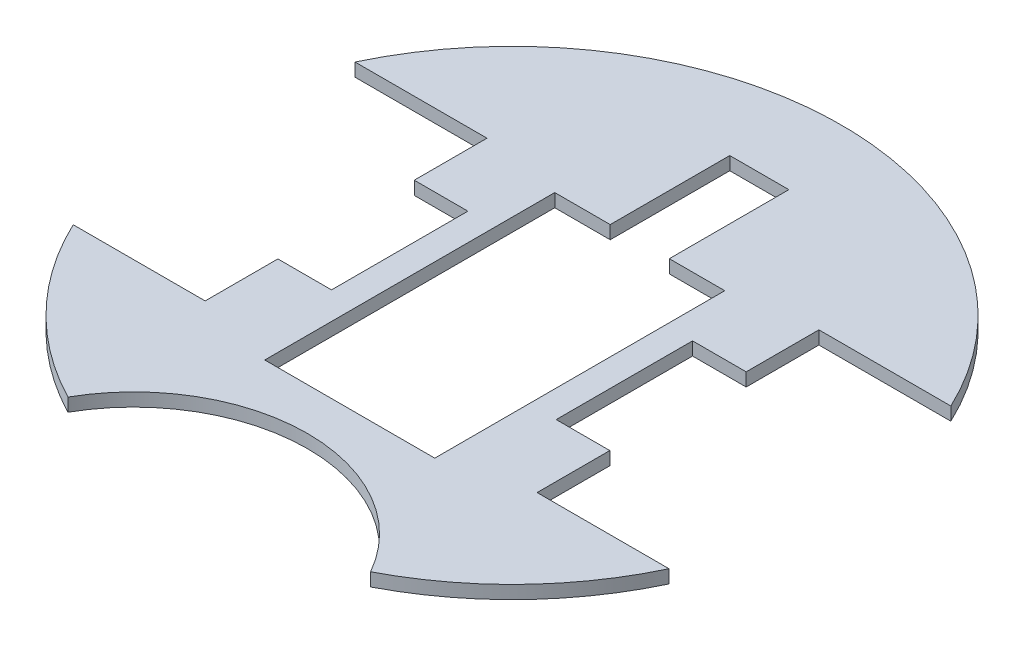
ISO-10303-21;
HEADER;
FILE_DESCRIPTION(('STEP AP214'),'2;1');
FILE_NAME('part.step','',(''),(''),'','','');
FILE_SCHEMA(('AUTOMOTIVE_DESIGN { 1 0 10303 214 1 1 1 1 }'));
ENDSEC;
DATA;
#1=APPLICATION_CONTEXT('core data for automotive mechanical design processes');
#2=APPLICATION_PROTOCOL_DEFINITION('international standard','automotive_design',2000,#1);
#3=PRODUCT_CONTEXT('',#1,'mechanical');
#4=PRODUCT('Part','Part','',(#3));
#5=PRODUCT_RELATED_PRODUCT_CATEGORY('part','',(#4));
#6=PRODUCT_DEFINITION_FORMATION('','',#4);
#7=PRODUCT_DEFINITION_CONTEXT('part definition',#1,'design');
#8=PRODUCT_DEFINITION('design','',#6,#7);
#9=PRODUCT_DEFINITION_SHAPE('','',#8);
#10=(LENGTH_UNIT() NAMED_UNIT(*) SI_UNIT(.MILLI.,.METRE.));
#11=(NAMED_UNIT(*) PLANE_ANGLE_UNIT() SI_UNIT($,.RADIAN.));
#12=(NAMED_UNIT(*) SI_UNIT($,.STERADIAN.) SOLID_ANGLE_UNIT());
#13=UNCERTAINTY_MEASURE_WITH_UNIT(LENGTH_MEASURE(1.E-05),#10,'distance_accuracy_value','');
#14=(GEOMETRIC_REPRESENTATION_CONTEXT(3) GLOBAL_UNCERTAINTY_ASSIGNED_CONTEXT((#13)) GLOBAL_UNIT_ASSIGNED_CONTEXT((#10,
#11,#12)) REPRESENTATION_CONTEXT('',''));
#15=CARTESIAN_POINT('',(0.,0.,0.));
#16=DIRECTION('',(0.,0.,1.));
#17=DIRECTION('',(1.,0.,0.));
#18=AXIS2_PLACEMENT_3D('',#15,#16,#17);
#19=CARTESIAN_POINT('',(18.7,0.,-28.1));
#20=DIRECTION('',(0.,0.,-1.));
#21=DIRECTION('',(-1.,0.,0.));
#22=AXIS2_PLACEMENT_3D('',#19,#20,#21);
#23=PLANE('',#22);
#24=DIRECTION('',(-1.,0.,0.));
#25=VECTOR('',#24,1.);
#26=CARTESIAN_POINT('',(18.7,0.,-28.1));
#27=LINE('',#26,#25);
#28=CARTESIAN_POINT('',(-6.5,0.,-28.1));
#29=VERTEX_POINT('',#28);
#30=CARTESIAN_POINT('',(-18.7,0.,-28.1));
#31=VERTEX_POINT('',#30);
#32=EDGE_CURVE('E221',#29,#31,#27,.T.);
#33=ORIENTED_EDGE('',*,*,#32,.F.);
#34=DIRECTION('',(0.,1.,0.));
#35=VECTOR('',#34,1.);
#36=CARTESIAN_POINT('',(-6.5,0.,-28.1));
#37=LINE('',#36,#35);
#38=CARTESIAN_POINT('',(-6.5,2.9,-28.1));
#39=VERTEX_POINT('',#38);
#40=EDGE_CURVE('E205',#29,#39,#37,.T.);
#41=ORIENTED_EDGE('',*,*,#40,.T.);
#42=DIRECTION('',(-1.,0.,0.));
#43=VECTOR('',#42,1.);
#44=CARTESIAN_POINT('',(18.7,2.9,-28.1));
#45=LINE('',#44,#43);
#46=CARTESIAN_POINT('',(-18.7,2.9,-28.1));
#47=VERTEX_POINT('',#46);
#48=EDGE_CURVE('E248',#39,#47,#45,.T.);
#49=ORIENTED_EDGE('',*,*,#48,.T.);
#50=DIRECTION('',(0.,1.,0.));
#51=VECTOR('',#50,1.);
#52=CARTESIAN_POINT('',(-18.7,0.,-28.1));
#53=LINE('',#52,#51);
#54=EDGE_CURVE('E227',#31,#47,#53,.T.);
#55=ORIENTED_EDGE('',*,*,#54,.F.);
#56=EDGE_LOOP('',(#33,#41,#49,#55));
#57=FACE_BOUND('',#56,.T.);
#58=ADVANCED_FACE('F32',(#57),#23,.F.);
#59=CARTESIAN_POINT('',(0.,2.9,0.));
#60=DIRECTION('',(0.,-1.,0.));
#61=DIRECTION('',(0.,0.,-1.));
#62=AXIS2_PLACEMENT_3D('',#59,#60,#61);
#63=CYLINDRICAL_SURFACE('',#62,72.5);
#64=CARTESIAN_POINT('',(0.,0.,0.));
#65=DIRECTION('',(0.,1.,0.));
#66=DIRECTION('',(0.,0.,1.));
#67=AXIS2_PLACEMENT_3D('',#64,#65,#66);
#68=CIRCLE('',#67,72.5);
#69=CARTESIAN_POINT('',(33.2911053697012,0.,64.4045984636458));
#70=VERTEX_POINT('',#69);
#71=CARTESIAN_POINT('',(65.5381568248605,0.,30.9999999999999));
#72=VERTEX_POINT('',#71);
#73=EDGE_CURVE('E265',#70,#72,#68,.T.);
#74=ORIENTED_EDGE('',*,*,#73,.T.);
#75=DIRECTION('',(0.,1.,0.));
#76=VECTOR('',#75,1.);
#77=CARTESIAN_POINT('',(65.5381568248605,0.,30.9999999999999));
#78=LINE('',#77,#76);
#79=CARTESIAN_POINT('',(65.5381568248605,2.9,30.9999999999999));
#80=VERTEX_POINT('',#79);
#81=EDGE_CURVE('E293',#72,#80,#78,.T.);
#82=ORIENTED_EDGE('',*,*,#81,.T.);
#83=CARTESIAN_POINT('',(0.,2.9,0.));
#84=DIRECTION('',(0.,1.,0.));
#85=DIRECTION('',(0.,0.,1.));
#86=AXIS2_PLACEMENT_3D('',#83,#84,#85);
#87=CIRCLE('',#86,72.5);
#88=CARTESIAN_POINT('',(33.2911053697012,2.9,64.4045984636458));
#89=VERTEX_POINT('',#88);
#90=EDGE_CURVE('E266',#89,#80,#87,.T.);
#91=ORIENTED_EDGE('',*,*,#90,.F.);
#92=DIRECTION('',(0.,-1.,0.));
#93=VECTOR('',#92,1.);
#94=CARTESIAN_POINT('',(33.2911053697012,2.9,64.4045984636458));
#95=LINE('',#94,#93);
#96=EDGE_CURVE('E11',#89,#70,#95,.T.);
#97=ORIENTED_EDGE('',*,*,#96,.T.);
#98=EDGE_LOOP('',(#74,#82,#91,#97));
#99=FACE_BOUND('',#98,.T.);
#100=ADVANCED_FACE('F292',(#99),#63,.T.);
#101=CARTESIAN_POINT('',(-65.5381568248605,2.9,30.9999999999999));
#102=VERTEX_POINT('',#101);
#103=CARTESIAN_POINT('',(-33.2911053697012,2.9,64.4045984636458));
#104=VERTEX_POINT('',#103);
#105=EDGE_CURVE('E264',#102,#104,#87,.T.);
#106=ORIENTED_EDGE('',*,*,#105,.F.);
#107=DIRECTION('',(0.,1.,0.));
#108=VECTOR('',#107,1.);
#109=CARTESIAN_POINT('',(-65.5381568248605,0.,30.9999999999999));
#110=LINE('',#109,#108);
#111=CARTESIAN_POINT('',(-65.5381568248605,0.,30.9999999999999));
#112=VERTEX_POINT('',#111);
#113=EDGE_CURVE('E326',#112,#102,#110,.T.);
#114=ORIENTED_EDGE('',*,*,#113,.F.);
#115=CARTESIAN_POINT('',(-33.2911053697012,0.,64.4045984636458));
#116=VERTEX_POINT('',#115);
#117=EDGE_CURVE('E272',#112,#116,#68,.T.);
#118=ORIENTED_EDGE('',*,*,#117,.T.);
#119=DIRECTION('',(0.,-1.,0.));
#120=VECTOR('',#119,1.);
#121=CARTESIAN_POINT('',(-33.2911053697012,2.9,64.4045984636458));
#122=LINE('',#121,#120);
#123=EDGE_CURVE('E40',#104,#116,#122,.T.);
#124=ORIENTED_EDGE('',*,*,#123,.F.);
#125=EDGE_LOOP('',(#106,#114,#118,#124));
#126=FACE_BOUND('',#125,.T.);
#127=ADVANCED_FACE('F460',(#126),#63,.T.);
#128=CARTESIAN_POINT('',(0.,2.9,83.2397996376034));
#129=DIRECTION('',(0.,-1.,0.));
#130=DIRECTION('',(0.,0.,-1.));
#131=AXIS2_PLACEMENT_3D('',#128,#129,#130);
#132=CYLINDRICAL_SURFACE('',#131,38.25);
#133=CARTESIAN_POINT('',(0.,0.,83.2397996376034));
#134=DIRECTION('',(0.,-1.,0.));
#135=DIRECTION('',(0.,0.,1.));
#136=AXIS2_PLACEMENT_3D('',#133,#134,#135);
#137=CIRCLE('',#136,38.25);
#138=EDGE_CURVE('E254',#116,#70,#137,.T.);
#139=ORIENTED_EDGE('',*,*,#138,.T.);
#140=ORIENTED_EDGE('',*,*,#96,.F.);
#141=CARTESIAN_POINT('',(0.,2.9,83.2397996376034));
#142=DIRECTION('',(0.,-1.,0.));
#143=DIRECTION('',(0.,0.,1.));
#144=AXIS2_PLACEMENT_3D('',#141,#142,#143);
#145=CIRCLE('',#144,38.25);
#146=EDGE_CURVE('E261',#104,#89,#145,.T.);
#147=ORIENTED_EDGE('',*,*,#146,.F.);
#148=ORIENTED_EDGE('',*,*,#123,.T.);
#149=EDGE_LOOP('',(#139,#140,#147,#148));
#150=FACE_BOUND('',#149,.T.);
#151=ADVANCED_FACE('F34',(#150),#132,.F.);
#152=CARTESIAN_POINT('',(65.5381568248604,2.9,-31.0000000000001));
#153=VERTEX_POINT('',#152);
#154=CARTESIAN_POINT('',(-65.5381568248604,2.9,-31.0000000000001));
#155=VERTEX_POINT('',#154);
#156=EDGE_CURVE('E269',#153,#155,#87,.T.);
#157=ORIENTED_EDGE('',*,*,#156,.F.);
#158=DIRECTION('',(0.,1.,0.));
#159=VECTOR('',#158,1.);
#160=CARTESIAN_POINT('',(65.5381568248604,0.,-31.0000000000001));
#161=LINE('',#160,#159);
#162=CARTESIAN_POINT('',(65.5381568248604,0.,-31.0000000000001));
#163=VERTEX_POINT('',#162);
#164=EDGE_CURVE('E382',#163,#153,#161,.T.);
#165=ORIENTED_EDGE('',*,*,#164,.F.);
#166=CARTESIAN_POINT('',(-65.5381568248604,0.,-31.0000000000001));
#167=VERTEX_POINT('',#166);
#168=EDGE_CURVE('E274',#163,#167,#68,.T.);
#169=ORIENTED_EDGE('',*,*,#168,.T.);
#170=DIRECTION('',(0.,1.,0.));
#171=VECTOR('',#170,1.);
#172=CARTESIAN_POINT('',(-65.5381568248604,0.,-31.0000000000001));
#173=LINE('',#172,#171);
#174=EDGE_CURVE('E318',#167,#155,#173,.T.);
#175=ORIENTED_EDGE('',*,*,#174,.T.);
#176=EDGE_LOOP('',(#157,#165,#169,#175));
#177=FACE_BOUND('',#176,.T.);
#178=ADVANCED_FACE('F324',(#177),#63,.T.);
#179=CARTESIAN_POINT('',(0.,2.9,41.6198998188017));
#180=DIRECTION('',(0.,1.,0.));
#181=DIRECTION('',(0.,0.,1.));
#182=AXIS2_PLACEMENT_3D('',#179,#180,#181);
#183=PLANE('',#182);
#184=DIRECTION('',(0.,0.,1.));
#185=VECTOR('',#184,1.);
#186=CARTESIAN_POINT('',(-6.5,2.9,-28.1));
#187=LINE('',#186,#185);
#188=CARTESIAN_POINT('',(-6.5,2.9,-54.4));
#189=VERTEX_POINT('',#188);
#190=EDGE_CURVE('E211',#189,#39,#187,.T.);
#191=ORIENTED_EDGE('',*,*,#190,.F.);
#192=DIRECTION('',(-1.,0.,0.));
#193=VECTOR('',#192,1.);
#194=CARTESIAN_POINT('',(6.5,2.9,-54.4));
#195=LINE('',#194,#193);
#196=CARTESIAN_POINT('',(6.5,2.9,-54.4));
#197=VERTEX_POINT('',#196);
#198=EDGE_CURVE('E224',#197,#189,#195,.T.);
#199=ORIENTED_EDGE('',*,*,#198,.F.);
#200=DIRECTION('',(0.,0.,-1.));
#201=VECTOR('',#200,1.);
#202=CARTESIAN_POINT('',(6.5,2.9,-28.1));
#203=LINE('',#202,#201);
#204=CARTESIAN_POINT('',(6.5,2.9,-28.1));
#205=VERTEX_POINT('',#204);
#206=EDGE_CURVE('E355',#205,#197,#203,.T.);
#207=ORIENTED_EDGE('',*,*,#206,.F.);
#208=CARTESIAN_POINT('',(18.7,2.9,-28.1));
#209=VERTEX_POINT('',#208);
#210=EDGE_CURVE('E249',#209,#205,#45,.T.);
#211=ORIENTED_EDGE('',*,*,#210,.F.);
#212=DIRECTION('',(0.,0.,-1.));
#213=VECTOR('',#212,1.);
#214=CARTESIAN_POINT('',(18.7,2.9,35.7));
#215=LINE('',#214,#213);
#216=CARTESIAN_POINT('',(18.7,2.9,35.7));
#217=VERTEX_POINT('',#216);
#218=EDGE_CURVE('E245',#217,#209,#215,.T.);
#219=ORIENTED_EDGE('',*,*,#218,.F.);
#220=DIRECTION('',(1.,0.,0.));
#221=VECTOR('',#220,1.);
#222=CARTESIAN_POINT('',(-18.7,2.9,35.7));
#223=LINE('',#222,#221);
#224=CARTESIAN_POINT('',(-18.7,2.9,35.7));
#225=VERTEX_POINT('',#224);
#226=EDGE_CURVE('E241',#225,#217,#223,.T.);
#227=ORIENTED_EDGE('',*,*,#226,.F.);
#228=DIRECTION('',(0.,0.,1.));
#229=VECTOR('',#228,1.);
#230=CARTESIAN_POINT('',(-18.7,2.9,-28.1));
#231=LINE('',#230,#229);
#232=EDGE_CURVE('E239',#47,#225,#231,.T.);
#233=ORIENTED_EDGE('',*,*,#232,.F.);
#234=ORIENTED_EDGE('',*,*,#48,.F.);
#235=EDGE_LOOP('',(#191,#199,#207,#211,#219,#227,#233,#234));
#236=FACE_BOUND('',#235,.T.);
#237=DIRECTION('',(1.,0.,0.));
#238=VECTOR('',#237,1.);
#239=CARTESIAN_POINT('',(36.5100000000001,2.9,30.9999999999999));
#240=LINE('',#239,#238);
#241=CARTESIAN_POINT('',(36.5100000000001,2.9,30.9999999999999));
#242=VERTEX_POINT('',#241);
#243=EDGE_CURVE('E368',#242,#80,#240,.T.);
#244=ORIENTED_EDGE('',*,*,#243,.F.);
#245=DIRECTION('',(0.,0.,1.));
#246=VECTOR('',#245,1.);
#247=CARTESIAN_POINT('',(36.5100000000001,2.9,15.));
#248=LINE('',#247,#246);
#249=CARTESIAN_POINT('',(36.5100000000001,2.9,15.));
#250=VERTEX_POINT('',#249);
#251=EDGE_CURVE('E396',#250,#242,#248,.T.);
#252=ORIENTED_EDGE('',*,*,#251,.F.);
#253=DIRECTION('',(1.,0.,0.));
#254=VECTOR('',#253,1.);
#255=CARTESIAN_POINT('',(24.7100000000001,2.9,15.));
#256=LINE('',#255,#254);
#257=CARTESIAN_POINT('',(24.7100000000001,2.9,15.));
#258=VERTEX_POINT('',#257);
#259=EDGE_CURVE('E393',#258,#250,#256,.T.);
#260=ORIENTED_EDGE('',*,*,#259,.F.);
#261=DIRECTION('',(0.,0.,1.));
#262=VECTOR('',#261,1.);
#263=CARTESIAN_POINT('',(24.7100000000001,2.9,-15.0000000000001));
#264=LINE('',#263,#262);
#265=CARTESIAN_POINT('',(24.7100000000001,2.9,-15.0000000000001));
#266=VERTEX_POINT('',#265);
#267=EDGE_CURVE('E390',#266,#258,#264,.T.);
#268=ORIENTED_EDGE('',*,*,#267,.F.);
#269=DIRECTION('',(-1.,0.,0.));
#270=VECTOR('',#269,1.);
#271=CARTESIAN_POINT('',(24.7100000000001,2.9,-15.0000000000001));
#272=LINE('',#271,#270);
#273=CARTESIAN_POINT('',(36.5100000000001,2.9,-15.0000000000001));
#274=VERTEX_POINT('',#273);
#275=EDGE_CURVE('E387',#274,#266,#272,.T.);
#276=ORIENTED_EDGE('',*,*,#275,.F.);
#277=DIRECTION('',(0.,0.,1.));
#278=VECTOR('',#277,1.);
#279=CARTESIAN_POINT('',(36.5100000000001,2.9,-15.0000000000001));
#280=LINE('',#279,#278);
#281=CARTESIAN_POINT('',(36.5100000000001,2.9,-31.0000000000001));
#282=VERTEX_POINT('',#281);
#283=EDGE_CURVE('E384',#282,#274,#280,.T.);
#284=ORIENTED_EDGE('',*,*,#283,.F.);
#285=DIRECTION('',(-1.,0.,0.));
#286=VECTOR('',#285,1.);
#287=CARTESIAN_POINT('',(36.5100000000001,2.9,-31.0000000000001));
#288=LINE('',#287,#286);
#289=EDGE_CURVE('E310',#153,#282,#288,.T.);
#290=ORIENTED_EDGE('',*,*,#289,.F.);
#291=ORIENTED_EDGE('',*,*,#156,.T.);
#292=DIRECTION('',(-1.,0.,0.));
#293=VECTOR('',#292,1.);
#294=CARTESIAN_POINT('',(-36.5100000000001,2.9,-31.0000000000001));
#295=LINE('',#294,#293);
#296=CARTESIAN_POINT('',(-36.5100000000001,2.9,-31.0000000000001));
#297=VERTEX_POINT('',#296);
#298=EDGE_CURVE('E307',#297,#155,#295,.T.);
#299=ORIENTED_EDGE('',*,*,#298,.F.);
#300=DIRECTION('',(0.,0.,-1.));
#301=VECTOR('',#300,1.);
#302=CARTESIAN_POINT('',(-36.5100000000001,2.9,-15.0000000000001));
#303=LINE('',#302,#301);
#304=CARTESIAN_POINT('',(-36.5100000000001,2.9,-15.0000000000001));
#305=VERTEX_POINT('',#304);
#306=EDGE_CURVE('E322',#305,#297,#303,.T.);
#307=ORIENTED_EDGE('',*,*,#306,.F.);
#308=DIRECTION('',(-1.,0.,0.));
#309=VECTOR('',#308,1.);
#310=CARTESIAN_POINT('',(-24.7100000000001,2.9,-15.0000000000001));
#311=LINE('',#310,#309);
#312=CARTESIAN_POINT('',(-24.7100000000001,2.9,-15.0000000000001));
#313=VERTEX_POINT('',#312);
#314=EDGE_CURVE('E436',#313,#305,#311,.T.);
#315=ORIENTED_EDGE('',*,*,#314,.F.);
#316=DIRECTION('',(0.,0.,-1.));
#317=VECTOR('',#316,1.);
#318=CARTESIAN_POINT('',(-24.7100000000001,2.9,-15.0000000000001));
#319=LINE('',#318,#317);
#320=CARTESIAN_POINT('',(-24.7100000000001,2.9,15.));
#321=VERTEX_POINT('',#320);
#322=EDGE_CURVE('E401',#321,#313,#319,.T.);
#323=ORIENTED_EDGE('',*,*,#322,.F.);
#324=DIRECTION('',(1.,0.,0.));
#325=VECTOR('',#324,1.);
#326=CARTESIAN_POINT('',(-24.7100000000001,2.9,15.));
#327=LINE('',#326,#325);
#328=CARTESIAN_POINT('',(-36.5100000000001,2.9,15.));
#329=VERTEX_POINT('',#328);
#330=EDGE_CURVE('E419',#329,#321,#327,.T.);
#331=ORIENTED_EDGE('',*,*,#330,.F.);
#332=DIRECTION('',(0.,0.,-1.));
#333=VECTOR('',#332,1.);
#334=CARTESIAN_POINT('',(-36.5100000000001,2.9,15.));
#335=LINE('',#334,#333);
#336=CARTESIAN_POINT('',(-36.5100000000001,2.9,30.9999999999999));
#337=VERTEX_POINT('',#336);
#338=EDGE_CURVE('E441',#337,#329,#335,.T.);
#339=ORIENTED_EDGE('',*,*,#338,.F.);
#340=DIRECTION('',(1.,0.,0.));
#341=VECTOR('',#340,1.);
#342=CARTESIAN_POINT('',(-36.5100000000001,2.9,30.9999999999999));
#343=LINE('',#342,#341);
#344=EDGE_CURVE('E300',#102,#337,#343,.T.);
#345=ORIENTED_EDGE('',*,*,#344,.F.);
#346=ORIENTED_EDGE('',*,*,#105,.T.);
#347=ORIENTED_EDGE('',*,*,#146,.T.);
#348=ORIENTED_EDGE('',*,*,#90,.T.);
#349=EDGE_LOOP('',(#244,#252,#260,#268,#276,#284,#290,#291,#299,#307,#315,#323,#331,#339,#345,
#346,#347,#348));
#350=FACE_BOUND('',#349,.T.);
#351=ADVANCED_FACE('F296',(#236,#350),#183,.T.);
#352=CARTESIAN_POINT('',(0.,0.,41.6198998188017));
#353=DIRECTION('',(0.,1.,0.));
#354=DIRECTION('',(0.,0.,1.));
#355=AXIS2_PLACEMENT_3D('',#352,#353,#354);
#356=PLANE('',#355);
#357=DIRECTION('',(0.,0.,1.));
#358=VECTOR('',#357,1.);
#359=CARTESIAN_POINT('',(36.5100000000001,0.,15.));
#360=LINE('',#359,#358);
#361=CARTESIAN_POINT('',(36.5100000000001,0.,15.));
#362=VERTEX_POINT('',#361);
#363=CARTESIAN_POINT('',(36.5100000000001,0.,30.9999999999999));
#364=VERTEX_POINT('',#363);
#365=EDGE_CURVE('E379',#362,#364,#360,.T.);
#366=ORIENTED_EDGE('',*,*,#365,.T.);
#367=DIRECTION('',(1.,0.,0.));
#368=VECTOR('',#367,1.);
#369=CARTESIAN_POINT('',(36.5100000000001,0.,30.9999999999999));
#370=LINE('',#369,#368);
#371=EDGE_CURVE('E289',#364,#72,#370,.T.);
#372=ORIENTED_EDGE('',*,*,#371,.T.);
#373=ORIENTED_EDGE('',*,*,#73,.F.);
#374=ORIENTED_EDGE('',*,*,#138,.F.);
#375=ORIENTED_EDGE('',*,*,#117,.F.);
#376=DIRECTION('',(1.,0.,0.));
#377=VECTOR('',#376,1.);
#378=CARTESIAN_POINT('',(-36.5100000000001,0.,30.9999999999999));
#379=LINE('',#378,#377);
#380=CARTESIAN_POINT('',(-36.5100000000001,0.,30.9999999999999));
#381=VERTEX_POINT('',#380);
#382=EDGE_CURVE('E427',#112,#381,#379,.T.);
#383=ORIENTED_EDGE('',*,*,#382,.T.);
#384=DIRECTION('',(0.,0.,-1.));
#385=VECTOR('',#384,1.);
#386=CARTESIAN_POINT('',(-36.5100000000001,0.,15.));
#387=LINE('',#386,#385);
#388=CARTESIAN_POINT('',(-36.5100000000001,0.,15.));
#389=VERTEX_POINT('',#388);
#390=EDGE_CURVE('E429',#381,#389,#387,.T.);
#391=ORIENTED_EDGE('',*,*,#390,.T.);
#392=DIRECTION('',(1.,0.,0.));
#393=VECTOR('',#392,1.);
#394=CARTESIAN_POINT('',(-24.7100000000001,0.,15.));
#395=LINE('',#394,#393);
#396=CARTESIAN_POINT('',(-24.7100000000001,0.,15.));
#397=VERTEX_POINT('',#396);
#398=EDGE_CURVE('E337',#389,#397,#395,.T.);
#399=ORIENTED_EDGE('',*,*,#398,.T.);
#400=DIRECTION('',(0.,0.,-1.));
#401=VECTOR('',#400,1.);
#402=CARTESIAN_POINT('',(-24.7100000000001,0.,-15.0000000000001));
#403=LINE('',#402,#401);
#404=CARTESIAN_POINT('',(-24.7100000000001,0.,-15.0000000000001));
#405=VERTEX_POINT('',#404);
#406=EDGE_CURVE('E415',#397,#405,#403,.T.);
#407=ORIENTED_EDGE('',*,*,#406,.T.);
#408=DIRECTION('',(-1.,0.,0.));
#409=VECTOR('',#408,1.);
#410=CARTESIAN_POINT('',(-24.7100000000001,0.,-15.0000000000001));
#411=LINE('',#410,#409);
#412=CARTESIAN_POINT('',(-36.5100000000001,0.,-15.0000000000001));
#413=VERTEX_POINT('',#412);
#414=EDGE_CURVE('E418',#405,#413,#411,.T.);
#415=ORIENTED_EDGE('',*,*,#414,.T.);
#416=DIRECTION('',(0.,0.,-1.));
#417=VECTOR('',#416,1.);
#418=CARTESIAN_POINT('',(-36.5100000000001,0.,-15.0000000000001));
#419=LINE('',#418,#417);
#420=CARTESIAN_POINT('',(-36.5100000000001,0.,-31.0000000000001));
#421=VERTEX_POINT('',#420);
#422=EDGE_CURVE('E422',#413,#421,#419,.T.);
#423=ORIENTED_EDGE('',*,*,#422,.T.);
#424=DIRECTION('',(-1.,0.,0.));
#425=VECTOR('',#424,1.);
#426=CARTESIAN_POINT('',(-36.5100000000001,0.,-31.0000000000001));
#427=LINE('',#426,#425);
#428=EDGE_CURVE('E425',#421,#167,#427,.T.);
#429=ORIENTED_EDGE('',*,*,#428,.T.);
#430=ORIENTED_EDGE('',*,*,#168,.F.);
#431=DIRECTION('',(-1.,0.,0.));
#432=VECTOR('',#431,1.);
#433=CARTESIAN_POINT('',(36.5100000000001,0.,-31.0000000000001));
#434=LINE('',#433,#432);
#435=CARTESIAN_POINT('',(36.5100000000001,0.,-31.0000000000001));
#436=VERTEX_POINT('',#435);
#437=EDGE_CURVE('E365',#163,#436,#434,.T.);
#438=ORIENTED_EDGE('',*,*,#437,.T.);
#439=DIRECTION('',(0.,0.,1.));
#440=VECTOR('',#439,1.);
#441=CARTESIAN_POINT('',(36.5100000000001,0.,-15.0000000000001));
#442=LINE('',#441,#440);
#443=CARTESIAN_POINT('',(36.5100000000001,0.,-15.0000000000001));
#444=VERTEX_POINT('',#443);
#445=EDGE_CURVE('E55',#436,#444,#442,.T.);
#446=ORIENTED_EDGE('',*,*,#445,.T.);
#447=DIRECTION('',(-1.,0.,0.));
#448=VECTOR('',#447,1.);
#449=CARTESIAN_POINT('',(24.7100000000001,0.,-15.0000000000001));
#450=LINE('',#449,#448);
#451=CARTESIAN_POINT('',(24.7100000000001,0.,-15.0000000000001));
#452=VERTEX_POINT('',#451);
#453=EDGE_CURVE('E370',#444,#452,#450,.T.);
#454=ORIENTED_EDGE('',*,*,#453,.T.);
#455=DIRECTION('',(0.,0.,1.));
#456=VECTOR('',#455,1.);
#457=CARTESIAN_POINT('',(24.7100000000001,0.,-15.0000000000001));
#458=LINE('',#457,#456);
#459=CARTESIAN_POINT('',(24.7100000000001,0.,15.));
#460=VERTEX_POINT('',#459);
#461=EDGE_CURVE('E373',#452,#460,#458,.T.);
#462=ORIENTED_EDGE('',*,*,#461,.T.);
#463=DIRECTION('',(1.,0.,0.));
#464=VECTOR('',#463,1.);
#465=CARTESIAN_POINT('',(24.7100000000001,0.,15.));
#466=LINE('',#465,#464);
#467=EDGE_CURVE('E376',#460,#362,#466,.T.);
#468=ORIENTED_EDGE('',*,*,#467,.T.);
#469=EDGE_LOOP('',(#366,#372,#373,#374,#375,#383,#391,#399,#407,#415,#423,#429,#430,#438,#446,
#454,#462,#468));
#470=FACE_BOUND('',#469,.T.);
#471=DIRECTION('',(-1.,0.,0.));
#472=VECTOR('',#471,1.);
#473=CARTESIAN_POINT('',(6.5,0.,-54.4));
#474=LINE('',#473,#472);
#475=CARTESIAN_POINT('',(6.5,0.,-54.4));
#476=VERTEX_POINT('',#475);
#477=CARTESIAN_POINT('',(-6.5,0.,-54.4));
#478=VERTEX_POINT('',#477);
#479=EDGE_CURVE('E216',#476,#478,#474,.T.);
#480=ORIENTED_EDGE('',*,*,#479,.T.);
#481=DIRECTION('',(0.,0.,1.));
#482=VECTOR('',#481,1.);
#483=CARTESIAN_POINT('',(-6.5,0.,-28.1));
#484=LINE('',#483,#482);
#485=EDGE_CURVE('E208',#478,#29,#484,.T.);
#486=ORIENTED_EDGE('',*,*,#485,.T.);
#487=ORIENTED_EDGE('',*,*,#32,.T.);
#488=DIRECTION('',(0.,0.,1.));
#489=VECTOR('',#488,1.);
#490=CARTESIAN_POINT('',(-18.7,0.,-28.1));
#491=LINE('',#490,#489);
#492=CARTESIAN_POINT('',(-18.7,0.,35.7));
#493=VERTEX_POINT('',#492);
#494=EDGE_CURVE('E252',#31,#493,#491,.T.);
#495=ORIENTED_EDGE('',*,*,#494,.T.);
#496=DIRECTION('',(1.,0.,0.));
#497=VECTOR('',#496,1.);
#498=CARTESIAN_POINT('',(-18.7,0.,35.7));
#499=LINE('',#498,#497);
#500=CARTESIAN_POINT('',(18.7,0.,35.7));
#501=VERTEX_POINT('',#500);
#502=EDGE_CURVE('E235',#493,#501,#499,.T.);
#503=ORIENTED_EDGE('',*,*,#502,.T.);
#504=DIRECTION('',(0.,0.,-1.));
#505=VECTOR('',#504,1.);
#506=CARTESIAN_POINT('',(18.7,0.,35.7));
#507=LINE('',#506,#505);
#508=CARTESIAN_POINT('',(18.7,0.,-28.1));
#509=VERTEX_POINT('',#508);
#510=EDGE_CURVE('E230',#501,#509,#507,.T.);
#511=ORIENTED_EDGE('',*,*,#510,.T.);
#512=CARTESIAN_POINT('',(6.5,0.,-28.1));
#513=VERTEX_POINT('',#512);
#514=EDGE_CURVE('E229',#509,#513,#27,.T.);
#515=ORIENTED_EDGE('',*,*,#514,.T.);
#516=DIRECTION('',(0.,0.,-1.));
#517=VECTOR('',#516,1.);
#518=CARTESIAN_POINT('',(6.5,0.,-28.1));
#519=LINE('',#518,#517);
#520=EDGE_CURVE('E47',#513,#476,#519,.T.);
#521=ORIENTED_EDGE('',*,*,#520,.T.);
#522=EDGE_LOOP('',(#480,#486,#487,#495,#503,#511,#515,#521));
#523=FACE_BOUND('',#522,.T.);
#524=ADVANCED_FACE('F219',(#470,#523),#356,.F.);
#525=CARTESIAN_POINT('',(-18.7,0.,-28.1));
#526=DIRECTION('',(-1.,0.,0.));
#527=DIRECTION('',(0.,0.,1.));
#528=AXIS2_PLACEMENT_3D('',#525,#526,#527);
#529=PLANE('',#528);
#530=ORIENTED_EDGE('',*,*,#232,.T.);
#531=DIRECTION('',(0.,1.,0.));
#532=VECTOR('',#531,1.);
#533=CARTESIAN_POINT('',(-18.7,0.,35.7));
#534=LINE('',#533,#532);
#535=EDGE_CURVE('E233',#493,#225,#534,.T.);
#536=ORIENTED_EDGE('',*,*,#535,.F.);
#537=ORIENTED_EDGE('',*,*,#494,.F.);
#538=ORIENTED_EDGE('',*,*,#54,.T.);
#539=EDGE_LOOP('',(#530,#536,#537,#538));
#540=FACE_BOUND('',#539,.T.);
#541=ADVANCED_FACE('F475',(#540),#529,.F.);
#542=ORIENTED_EDGE('',*,*,#210,.T.);
#543=DIRECTION('',(0.,1.,0.));
#544=VECTOR('',#543,1.);
#545=CARTESIAN_POINT('',(6.5,0.,-28.1));
#546=LINE('',#545,#544);
#547=EDGE_CURVE('E215',#513,#205,#546,.T.);
#548=ORIENTED_EDGE('',*,*,#547,.F.);
#549=ORIENTED_EDGE('',*,*,#514,.F.);
#550=DIRECTION('',(0.,1.,0.));
#551=VECTOR('',#550,1.);
#552=CARTESIAN_POINT('',(18.7,0.,-28.1));
#553=LINE('',#552,#551);
#554=EDGE_CURVE('E255',#509,#209,#553,.T.);
#555=ORIENTED_EDGE('',*,*,#554,.T.);
#556=EDGE_LOOP('',(#542,#548,#549,#555));
#557=FACE_BOUND('',#556,.T.);
#558=ADVANCED_FACE('F350',(#557),#23,.F.);
#559=CARTESIAN_POINT('',(18.7,0.,35.7));
#560=DIRECTION('',(1.,0.,0.));
#561=DIRECTION('',(0.,0.,-1.));
#562=AXIS2_PLACEMENT_3D('',#559,#560,#561);
#563=PLANE('',#562);
#564=ORIENTED_EDGE('',*,*,#218,.T.);
#565=ORIENTED_EDGE('',*,*,#554,.F.);
#566=ORIENTED_EDGE('',*,*,#510,.F.);
#567=DIRECTION('',(0.,1.,0.));
#568=VECTOR('',#567,1.);
#569=CARTESIAN_POINT('',(18.7,0.,35.7));
#570=LINE('',#569,#568);
#571=EDGE_CURVE('E257',#501,#217,#570,.T.);
#572=ORIENTED_EDGE('',*,*,#571,.T.);
#573=EDGE_LOOP('',(#564,#565,#566,#572));
#574=FACE_BOUND('',#573,.T.);
#575=ADVANCED_FACE('F346',(#574),#563,.F.);
#576=CARTESIAN_POINT('',(-18.7,0.,35.7));
#577=DIRECTION('',(0.,0.,1.));
#578=DIRECTION('',(1.,0.,0.));
#579=AXIS2_PLACEMENT_3D('',#576,#577,#578);
#580=PLANE('',#579);
#581=ORIENTED_EDGE('',*,*,#226,.T.);
#582=ORIENTED_EDGE('',*,*,#571,.F.);
#583=ORIENTED_EDGE('',*,*,#502,.F.);
#584=ORIENTED_EDGE('',*,*,#535,.T.);
#585=EDGE_LOOP('',(#581,#582,#583,#584));
#586=FACE_BOUND('',#585,.T.);
#587=ADVANCED_FACE('F342',(#586),#580,.F.);
#588=CARTESIAN_POINT('',(-24.7100000000001,0.,-15.0000000000001));
#589=DIRECTION('',(1.,0.,0.));
#590=DIRECTION('',(0.,0.,-1.));
#591=AXIS2_PLACEMENT_3D('',#588,#589,#590);
#592=PLANE('',#591);
#593=ORIENTED_EDGE('',*,*,#322,.T.);
#594=DIRECTION('',(0.,1.,0.));
#595=VECTOR('',#594,1.);
#596=CARTESIAN_POINT('',(-24.7100000000001,0.,-15.0000000000001));
#597=LINE('',#596,#595);
#598=EDGE_CURVE('E335',#405,#313,#597,.T.);
#599=ORIENTED_EDGE('',*,*,#598,.F.);
#600=ORIENTED_EDGE('',*,*,#406,.F.);
#601=DIRECTION('',(0.,1.,0.));
#602=VECTOR('',#601,1.);
#603=CARTESIAN_POINT('',(-24.7100000000001,0.,15.));
#604=LINE('',#603,#602);
#605=EDGE_CURVE('E242',#397,#321,#604,.T.);
#606=ORIENTED_EDGE('',*,*,#605,.T.);
#607=EDGE_LOOP('',(#593,#599,#600,#606));
#608=FACE_BOUND('',#607,.T.);
#609=ADVANCED_FACE('F536',(#608),#592,.F.);
#610=CARTESIAN_POINT('',(-24.7100000000001,0.,15.));
#611=DIRECTION('',(0.,0.,1.));
#612=DIRECTION('',(1.,0.,0.));
#613=AXIS2_PLACEMENT_3D('',#610,#611,#612);
#614=PLANE('',#613);
#615=ORIENTED_EDGE('',*,*,#330,.T.);
#616=ORIENTED_EDGE('',*,*,#605,.F.);
#617=ORIENTED_EDGE('',*,*,#398,.F.);
#618=DIRECTION('',(0.,1.,0.));
#619=VECTOR('',#618,1.);
#620=CARTESIAN_POINT('',(-36.5100000000001,0.,15.));
#621=LINE('',#620,#619);
#622=EDGE_CURVE('E447',#389,#329,#621,.T.);
#623=ORIENTED_EDGE('',*,*,#622,.T.);
#624=EDGE_LOOP('',(#615,#616,#617,#623));
#625=FACE_BOUND('',#624,.T.);
#626=ADVANCED_FACE('F457',(#625),#614,.F.);
#627=CARTESIAN_POINT('',(-36.5100000000001,0.,15.));
#628=DIRECTION('',(1.,0.,0.));
#629=DIRECTION('',(0.,0.,-1.));
#630=AXIS2_PLACEMENT_3D('',#627,#628,#629);
#631=PLANE('',#630);
#632=ORIENTED_EDGE('',*,*,#338,.T.);
#633=ORIENTED_EDGE('',*,*,#622,.F.);
#634=ORIENTED_EDGE('',*,*,#390,.F.);
#635=DIRECTION('',(0.,1.,0.));
#636=VECTOR('',#635,1.);
#637=CARTESIAN_POINT('',(-36.5100000000001,0.,30.9999999999999));
#638=LINE('',#637,#636);
#639=EDGE_CURVE('E328',#381,#337,#638,.T.);
#640=ORIENTED_EDGE('',*,*,#639,.T.);
#641=EDGE_LOOP('',(#632,#633,#634,#640));
#642=FACE_BOUND('',#641,.T.);
#643=ADVANCED_FACE('F450',(#642),#631,.F.);
#644=CARTESIAN_POINT('',(-36.5100000000001,0.,30.9999999999999));
#645=DIRECTION('',(0.,0.,1.));
#646=DIRECTION('',(1.,0.,0.));
#647=AXIS2_PLACEMENT_3D('',#644,#645,#646);
#648=PLANE('',#647);
#649=ORIENTED_EDGE('',*,*,#344,.T.);
#650=ORIENTED_EDGE('',*,*,#639,.F.);
#651=ORIENTED_EDGE('',*,*,#382,.F.);
#652=ORIENTED_EDGE('',*,*,#113,.T.);
#653=EDGE_LOOP('',(#649,#650,#651,#652));
#654=FACE_BOUND('',#653,.T.);
#655=ADVANCED_FACE('F453',(#654),#648,.F.);
#656=CARTESIAN_POINT('',(-36.5100000000001,0.,-31.0000000000001));
#657=DIRECTION('',(0.,0.,-1.));
#658=DIRECTION('',(-1.,0.,0.));
#659=AXIS2_PLACEMENT_3D('',#656,#657,#658);
#660=PLANE('',#659);
#661=ORIENTED_EDGE('',*,*,#298,.T.);
#662=ORIENTED_EDGE('',*,*,#174,.F.);
#663=ORIENTED_EDGE('',*,*,#428,.F.);
#664=DIRECTION('',(0.,1.,0.));
#665=VECTOR('',#664,1.);
#666=CARTESIAN_POINT('',(-36.5100000000001,0.,-31.0000000000001));
#667=LINE('',#666,#665);
#668=EDGE_CURVE('E320',#421,#297,#667,.T.);
#669=ORIENTED_EDGE('',*,*,#668,.T.);
#670=EDGE_LOOP('',(#661,#662,#663,#669));
#671=FACE_BOUND('',#670,.T.);
#672=ADVANCED_FACE('F316',(#671),#660,.F.);
#673=CARTESIAN_POINT('',(-36.5100000000001,0.,-15.0000000000001));
#674=DIRECTION('',(1.,0.,0.));
#675=DIRECTION('',(0.,0.,-1.));
#676=AXIS2_PLACEMENT_3D('',#673,#674,#675);
#677=PLANE('',#676);
#678=ORIENTED_EDGE('',*,*,#306,.T.);
#679=ORIENTED_EDGE('',*,*,#668,.F.);
#680=ORIENTED_EDGE('',*,*,#422,.F.);
#681=DIRECTION('',(0.,1.,0.));
#682=VECTOR('',#681,1.);
#683=CARTESIAN_POINT('',(-36.5100000000001,0.,-15.0000000000001));
#684=LINE('',#683,#682);
#685=EDGE_CURVE('E330',#413,#305,#684,.T.);
#686=ORIENTED_EDGE('',*,*,#685,.T.);
#687=EDGE_LOOP('',(#678,#679,#680,#686));
#688=FACE_BOUND('',#687,.T.);
#689=ADVANCED_FACE('F543',(#688),#677,.F.);
#690=CARTESIAN_POINT('',(-24.7100000000001,0.,-15.0000000000001));
#691=DIRECTION('',(0.,0.,-1.));
#692=DIRECTION('',(-1.,0.,0.));
#693=AXIS2_PLACEMENT_3D('',#690,#691,#692);
#694=PLANE('',#693);
#695=ORIENTED_EDGE('',*,*,#314,.T.);
#696=ORIENTED_EDGE('',*,*,#685,.F.);
#697=ORIENTED_EDGE('',*,*,#414,.F.);
#698=ORIENTED_EDGE('',*,*,#598,.T.);
#699=EDGE_LOOP('',(#695,#696,#697,#698));
#700=FACE_BOUND('',#699,.T.);
#701=ADVANCED_FACE('F511',(#700),#694,.F.);
#702=CARTESIAN_POINT('',(36.5100000000001,0.,30.9999999999999));
#703=DIRECTION('',(0.,0.,1.));
#704=DIRECTION('',(1.,0.,0.));
#705=AXIS2_PLACEMENT_3D('',#702,#703,#704);
#706=PLANE('',#705);
#707=ORIENTED_EDGE('',*,*,#243,.T.);
#708=ORIENTED_EDGE('',*,*,#81,.F.);
#709=ORIENTED_EDGE('',*,*,#371,.F.);
#710=DIRECTION('',(0.,1.,0.));
#711=VECTOR('',#710,1.);
#712=CARTESIAN_POINT('',(36.5100000000001,0.,30.9999999999999));
#713=LINE('',#712,#711);
#714=EDGE_CURVE('E402',#364,#242,#713,.T.);
#715=ORIENTED_EDGE('',*,*,#714,.T.);
#716=EDGE_LOOP('',(#707,#708,#709,#715));
#717=FACE_BOUND('',#716,.T.);
#718=ADVANCED_FACE('F507',(#717),#706,.F.);
#719=CARTESIAN_POINT('',(36.5100000000001,0.,15.));
#720=DIRECTION('',(-1.,0.,0.));
#721=DIRECTION('',(0.,0.,1.));
#722=AXIS2_PLACEMENT_3D('',#719,#720,#721);
#723=PLANE('',#722);
#724=ORIENTED_EDGE('',*,*,#251,.T.);
#725=ORIENTED_EDGE('',*,*,#714,.F.);
#726=ORIENTED_EDGE('',*,*,#365,.F.);
#727=DIRECTION('',(0.,1.,0.));
#728=VECTOR('',#727,1.);
#729=CARTESIAN_POINT('',(36.5100000000001,0.,15.));
#730=LINE('',#729,#728);
#731=EDGE_CURVE('E404',#362,#250,#730,.T.);
#732=ORIENTED_EDGE('',*,*,#731,.T.);
#733=EDGE_LOOP('',(#724,#725,#726,#732));
#734=FACE_BOUND('',#733,.T.);
#735=ADVANCED_FACE('F510',(#734),#723,.F.);
#736=CARTESIAN_POINT('',(24.7100000000001,0.,15.));
#737=DIRECTION('',(0.,0.,1.));
#738=DIRECTION('',(1.,0.,0.));
#739=AXIS2_PLACEMENT_3D('',#736,#737,#738);
#740=PLANE('',#739);
#741=ORIENTED_EDGE('',*,*,#259,.T.);
#742=ORIENTED_EDGE('',*,*,#731,.F.);
#743=ORIENTED_EDGE('',*,*,#467,.F.);
#744=DIRECTION('',(0.,1.,0.));
#745=VECTOR('',#744,1.);
#746=CARTESIAN_POINT('',(24.7100000000001,0.,15.));
#747=LINE('',#746,#745);
#748=EDGE_CURVE('E406',#460,#258,#747,.T.);
#749=ORIENTED_EDGE('',*,*,#748,.T.);
#750=EDGE_LOOP('',(#741,#742,#743,#749));
#751=FACE_BOUND('',#750,.T.);
#752=ADVANCED_FACE('F515',(#751),#740,.F.);
#753=CARTESIAN_POINT('',(24.7100000000001,0.,-15.0000000000001));
#754=DIRECTION('',(-1.,0.,0.));
#755=DIRECTION('',(0.,0.,1.));
#756=AXIS2_PLACEMENT_3D('',#753,#754,#755);
#757=PLANE('',#756);
#758=ORIENTED_EDGE('',*,*,#267,.T.);
#759=ORIENTED_EDGE('',*,*,#748,.F.);
#760=ORIENTED_EDGE('',*,*,#461,.F.);
#761=DIRECTION('',(0.,1.,0.));
#762=VECTOR('',#761,1.);
#763=CARTESIAN_POINT('',(24.7100000000001,0.,-15.0000000000001));
#764=LINE('',#763,#762);
#765=EDGE_CURVE('E408',#452,#266,#764,.T.);
#766=ORIENTED_EDGE('',*,*,#765,.T.);
#767=EDGE_LOOP('',(#758,#759,#760,#766));
#768=FACE_BOUND('',#767,.T.);
#769=ADVANCED_FACE('F519',(#768),#757,.F.);
#770=CARTESIAN_POINT('',(24.7100000000001,0.,-15.0000000000001));
#771=DIRECTION('',(0.,0.,-1.));
#772=DIRECTION('',(-1.,0.,0.));
#773=AXIS2_PLACEMENT_3D('',#770,#771,#772);
#774=PLANE('',#773);
#775=ORIENTED_EDGE('',*,*,#275,.T.);
#776=ORIENTED_EDGE('',*,*,#765,.F.);
#777=ORIENTED_EDGE('',*,*,#453,.F.);
#778=DIRECTION('',(0.,1.,0.));
#779=VECTOR('',#778,1.);
#780=CARTESIAN_POINT('',(36.5100000000001,0.,-15.0000000000001));
#781=LINE('',#780,#779);
#782=EDGE_CURVE('E410',#444,#274,#781,.T.);
#783=ORIENTED_EDGE('',*,*,#782,.T.);
#784=EDGE_LOOP('',(#775,#776,#777,#783));
#785=FACE_BOUND('',#784,.T.);
#786=ADVANCED_FACE('F523',(#785),#774,.F.);
#787=CARTESIAN_POINT('',(36.5100000000001,0.,-15.0000000000001));
#788=DIRECTION('',(-1.,0.,0.));
#789=DIRECTION('',(0.,0.,1.));
#790=AXIS2_PLACEMENT_3D('',#787,#788,#789);
#791=PLANE('',#790);
#792=ORIENTED_EDGE('',*,*,#283,.T.);
#793=ORIENTED_EDGE('',*,*,#782,.F.);
#794=ORIENTED_EDGE('',*,*,#445,.F.);
#795=DIRECTION('',(0.,1.,0.));
#796=VECTOR('',#795,1.);
#797=CARTESIAN_POINT('',(36.5100000000001,0.,-31.0000000000001));
#798=LINE('',#797,#796);
#799=EDGE_CURVE('E412',#436,#282,#798,.T.);
#800=ORIENTED_EDGE('',*,*,#799,.T.);
#801=EDGE_LOOP('',(#792,#793,#794,#800));
#802=FACE_BOUND('',#801,.T.);
#803=ADVANCED_FACE('F527',(#802),#791,.F.);
#804=CARTESIAN_POINT('',(36.5100000000001,0.,-31.0000000000001));
#805=DIRECTION('',(0.,0.,-1.));
#806=DIRECTION('',(-1.,0.,0.));
#807=AXIS2_PLACEMENT_3D('',#804,#805,#806);
#808=PLANE('',#807);
#809=ORIENTED_EDGE('',*,*,#289,.T.);
#810=ORIENTED_EDGE('',*,*,#799,.F.);
#811=ORIENTED_EDGE('',*,*,#437,.F.);
#812=ORIENTED_EDGE('',*,*,#164,.T.);
#813=EDGE_LOOP('',(#809,#810,#811,#812));
#814=FACE_BOUND('',#813,.T.);
#815=ADVANCED_FACE('F504',(#814),#808,.F.);
#816=CARTESIAN_POINT('',(-6.5,0.,-28.1));
#817=DIRECTION('',(-1.,0.,0.));
#818=DIRECTION('',(0.,0.,1.));
#819=AXIS2_PLACEMENT_3D('',#816,#817,#818);
#820=PLANE('',#819);
#821=ORIENTED_EDGE('',*,*,#190,.T.);
#822=ORIENTED_EDGE('',*,*,#40,.F.);
#823=ORIENTED_EDGE('',*,*,#485,.F.);
#824=DIRECTION('',(0.,1.,0.));
#825=VECTOR('',#824,1.);
#826=CARTESIAN_POINT('',(-6.5,0.,-54.4));
#827=LINE('',#826,#825);
#828=EDGE_CURVE('E360',#478,#189,#827,.T.);
#829=ORIENTED_EDGE('',*,*,#828,.T.);
#830=EDGE_LOOP('',(#821,#822,#823,#829));
#831=FACE_BOUND('',#830,.T.);
#832=ADVANCED_FACE('F207',(#831),#820,.F.);
#833=CARTESIAN_POINT('',(6.5,0.,-54.4));
#834=DIRECTION('',(0.,0.,-1.));
#835=DIRECTION('',(-1.,0.,0.));
#836=AXIS2_PLACEMENT_3D('',#833,#834,#835);
#837=PLANE('',#836);
#838=ORIENTED_EDGE('',*,*,#198,.T.);
#839=ORIENTED_EDGE('',*,*,#828,.F.);
#840=ORIENTED_EDGE('',*,*,#479,.F.);
#841=DIRECTION('',(0.,1.,0.));
#842=VECTOR('',#841,1.);
#843=CARTESIAN_POINT('',(6.5,0.,-54.4));
#844=LINE('',#843,#842);
#845=EDGE_CURVE('E362',#476,#197,#844,.T.);
#846=ORIENTED_EDGE('',*,*,#845,.T.);
#847=EDGE_LOOP('',(#838,#839,#840,#846));
#848=FACE_BOUND('',#847,.T.);
#849=ADVANCED_FACE('F496',(#848),#837,.F.);
#850=CARTESIAN_POINT('',(6.5,0.,-28.1));
#851=DIRECTION('',(1.,0.,0.));
#852=DIRECTION('',(0.,0.,-1.));
#853=AXIS2_PLACEMENT_3D('',#850,#851,#852);
#854=PLANE('',#853);
#855=ORIENTED_EDGE('',*,*,#206,.T.);
#856=ORIENTED_EDGE('',*,*,#845,.F.);
#857=ORIENTED_EDGE('',*,*,#520,.F.);
#858=ORIENTED_EDGE('',*,*,#547,.T.);
#859=EDGE_LOOP('',(#855,#856,#857,#858));
#860=FACE_BOUND('',#859,.T.);
#861=ADVANCED_FACE('F494',(#860),#854,.F.);
#862=CLOSED_SHELL('',(#58,#100,#127,#151,#178,#351,#524,#541,#558,#575,#587,#609,#626,#643,#655,
#672,#689,#701,#718,#735,#752,#769,#786,#803,#815,#832,#849,#861));
#863=MANIFOLD_SOLID_BREP('B2',#862);
#864=ADVANCED_BREP_SHAPE_REPRESENTATION('',(#18,#863),#14);
#865=SHAPE_DEFINITION_REPRESENTATION(#9,#864);
ENDSEC;
END-ISO-10303-21;
